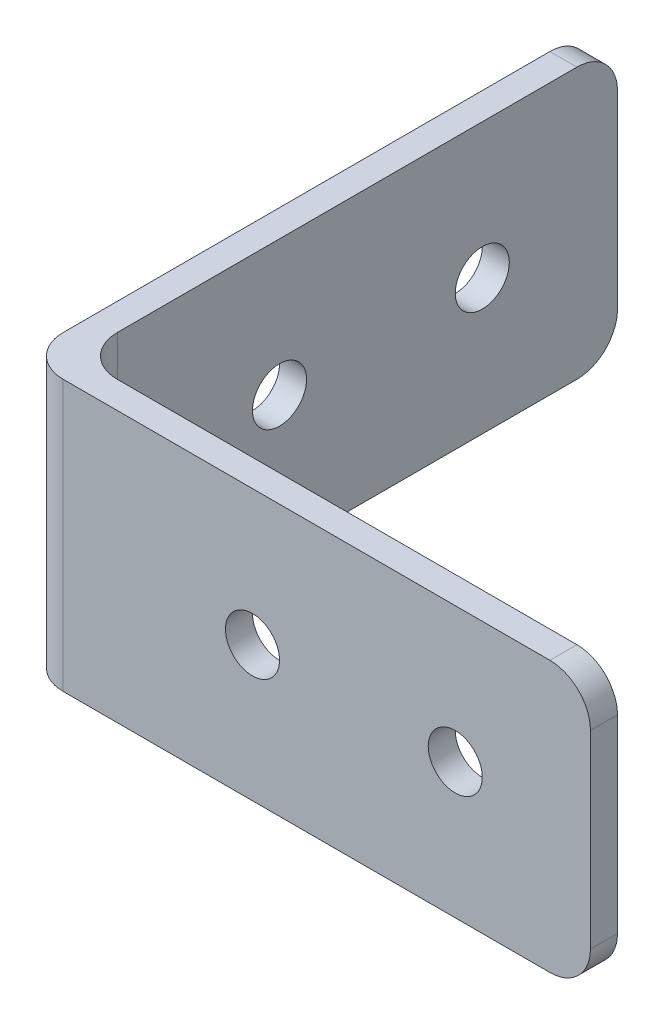
ISO-10303-21;
HEADER;
FILE_DESCRIPTION(('STEP AP214'),'2;1');
FILE_NAME('part.step','',(''),(''),'','','');
FILE_SCHEMA(('AUTOMOTIVE_DESIGN { 1 0 10303 214 1 1 1 1 }'));
ENDSEC;
DATA;
#1=APPLICATION_CONTEXT('core data for automotive mechanical design processes');
#2=APPLICATION_PROTOCOL_DEFINITION('international standard','automotive_design',2000,#1);
#3=PRODUCT_CONTEXT('',#1,'mechanical');
#4=PRODUCT('Part','Part','',(#3));
#5=PRODUCT_RELATED_PRODUCT_CATEGORY('part','',(#4));
#6=PRODUCT_DEFINITION_FORMATION('','',#4);
#7=PRODUCT_DEFINITION_CONTEXT('part definition',#1,'design');
#8=PRODUCT_DEFINITION('design','',#6,#7);
#9=PRODUCT_DEFINITION_SHAPE('','',#8);
#10=(LENGTH_UNIT() NAMED_UNIT(*) SI_UNIT(.MILLI.,.METRE.));
#11=(NAMED_UNIT(*) PLANE_ANGLE_UNIT() SI_UNIT($,.RADIAN.));
#12=(NAMED_UNIT(*) SI_UNIT($,.STERADIAN.) SOLID_ANGLE_UNIT());
#13=UNCERTAINTY_MEASURE_WITH_UNIT(LENGTH_MEASURE(1.E-05),#10,'distance_accuracy_value','');
#14=(GEOMETRIC_REPRESENTATION_CONTEXT(3) GLOBAL_UNCERTAINTY_ASSIGNED_CONTEXT((#13)) GLOBAL_UNIT_ASSIGNED_CONTEXT((#10,
#11,#12)) REPRESENTATION_CONTEXT('',''));
#15=CARTESIAN_POINT('',(0.,0.,0.));
#16=DIRECTION('',(0.,0.,1.));
#17=DIRECTION('',(1.,0.,0.));
#18=AXIS2_PLACEMENT_3D('',#15,#16,#17);
#19=CARTESIAN_POINT('',(-15.6448598130841,20.,-18.3551401869159));
#20=DIRECTION('',(0.,0.,1.));
#21=DIRECTION('',(1.,0.,0.));
#22=AXIS2_PLACEMENT_3D('',#19,#20,#21);
#23=PLANE('',#22);
#24=DIRECTION('',(0.,-1.,0.));
#25=VECTOR('',#24,1.);
#26=CARTESIAN_POINT('',(-13.6448598130841,20.,-18.3551401869159));
#27=LINE('',#26,#25);
#28=CARTESIAN_POINT('',(-13.6448598130841,17.,-18.3551401869159));
#29=VERTEX_POINT('',#28);
#30=CARTESIAN_POINT('',(-13.6448598130841,3.,-18.3551401869159));
#31=VERTEX_POINT('',#30);
#32=EDGE_CURVE('E161',#29,#31,#27,.T.);
#33=ORIENTED_EDGE('',*,*,#32,.T.);
#34=DIRECTION('',(-1.,0.,0.));
#35=VECTOR('',#34,1.);
#36=CARTESIAN_POINT('',(-15.6448598130841,3.,-18.3551401869159));
#37=LINE('',#36,#35);
#38=CARTESIAN_POINT('',(-15.6448598130841,3.,-18.3551401869159));
#39=VERTEX_POINT('',#38);
#40=EDGE_CURVE('E207',#31,#39,#37,.T.);
#41=ORIENTED_EDGE('',*,*,#40,.T.);
#42=DIRECTION('',(0.,-1.,0.));
#43=VECTOR('',#42,1.);
#44=CARTESIAN_POINT('',(-15.6448598130841,20.,-18.3551401869159));
#45=LINE('',#44,#43);
#46=CARTESIAN_POINT('',(-15.6448598130841,17.,-18.3551401869159));
#47=VERTEX_POINT('',#46);
#48=EDGE_CURVE('E177',#47,#39,#45,.T.);
#49=ORIENTED_EDGE('',*,*,#48,.F.);
#50=DIRECTION('',(-1.,0.,0.));
#51=VECTOR('',#50,1.);
#52=CARTESIAN_POINT('',(-15.6448598130841,17.,-18.3551401869159));
#53=LINE('',#52,#51);
#54=EDGE_CURVE('E54',#47,#29,#53,.F.);
#55=ORIENTED_EDGE('',*,*,#54,.T.);
#56=EDGE_LOOP('',(#33,#41,#49,#55));
#57=FACE_BOUND('',#56,.T.);
#58=ADVANCED_FACE('F32',(#57),#23,.F.);
#59=CARTESIAN_POINT('',(-15.6448598130841,20.,23.6448598130841));
#60=DIRECTION('',(1.,0.,0.));
#61=DIRECTION('',(0.,0.,-1.));
#62=AXIS2_PLACEMENT_3D('',#59,#60,#61);
#63=PLANE('',#62);
#64=CARTESIAN_POINT('',(-15.6448598130841,10.,6.64485981308411));
#65=DIRECTION('',(1.,0.,0.));
#66=DIRECTION('',(0.,0.,-1.));
#67=AXIS2_PLACEMENT_3D('',#64,#65,#66);
#68=CIRCLE('',#67,2.);
#69=CARTESIAN_POINT('',(-15.6448598130841,10.,4.64485981308411));
#70=VERTEX_POINT('',#69);
#71=EDGE_CURVE('E306',#70,#70,#68,.T.);
#72=ORIENTED_EDGE('',*,*,#71,.T.);
#73=EDGE_LOOP('',(#72));
#74=FACE_BOUND('',#73,.T.);
#75=CARTESIAN_POINT('',(-15.6448598130841,10.,-8.35514018691589));
#76=DIRECTION('',(1.,0.,0.));
#77=DIRECTION('',(0.,0.,-1.));
#78=AXIS2_PLACEMENT_3D('',#75,#76,#77);
#79=CIRCLE('',#78,2.);
#80=CARTESIAN_POINT('',(-15.6448598130841,10.,-10.3551401869159));
#81=VERTEX_POINT('',#80);
#82=EDGE_CURVE('E314',#81,#81,#79,.T.);
#83=ORIENTED_EDGE('',*,*,#82,.T.);
#84=EDGE_LOOP('',(#83));
#85=FACE_BOUND('',#84,.T.);
#86=ORIENTED_EDGE('',*,*,#48,.T.);
#87=CARTESIAN_POINT('',(-15.6448598130841,3.,-15.3551401869159));
#88=DIRECTION('',(1.,0.,0.));
#89=DIRECTION('',(0.,0.,-1.));
#90=AXIS2_PLACEMENT_3D('',#87,#88,#89);
#91=CIRCLE('',#90,3.);
#92=CARTESIAN_POINT('',(-15.6448598130841,0.,-15.3551401869159));
#93=VERTEX_POINT('',#92);
#94=EDGE_CURVE('E129',#39,#93,#91,.F.);
#95=ORIENTED_EDGE('',*,*,#94,.T.);
#96=DIRECTION('',(0.,0.,1.));
#97=VECTOR('',#96,1.);
#98=CARTESIAN_POINT('',(-15.6448598130841,0.,23.6448598130841));
#99=LINE('',#98,#97);
#100=CARTESIAN_POINT('',(-15.6448598130841,0.,20.6448598130841));
#101=VERTEX_POINT('',#100);
#102=EDGE_CURVE('E162',#93,#101,#99,.T.);
#103=ORIENTED_EDGE('',*,*,#102,.T.);
#104=DIRECTION('',(0.,-1.,0.));
#105=VECTOR('',#104,1.);
#106=CARTESIAN_POINT('',(-15.6448598130841,20.,20.6448598130841));
#107=LINE('',#106,#105);
#108=CARTESIAN_POINT('',(-15.6448598130841,20.,20.6448598130841));
#109=VERTEX_POINT('',#108);
#110=EDGE_CURVE('E130',#101,#109,#107,.F.);
#111=ORIENTED_EDGE('',*,*,#110,.T.);
#112=DIRECTION('',(0.,0.,1.));
#113=VECTOR('',#112,1.);
#114=CARTESIAN_POINT('',(-15.6448598130841,20.,23.6448598130841));
#115=LINE('',#114,#113);
#116=CARTESIAN_POINT('',(-15.6448598130841,20.,-15.3551401869159));
#117=VERTEX_POINT('',#116);
#118=EDGE_CURVE('E137',#117,#109,#115,.T.);
#119=ORIENTED_EDGE('',*,*,#118,.F.);
#120=CARTESIAN_POINT('',(-15.6448598130841,17.,-15.3551401869159));
#121=DIRECTION('',(1.,0.,0.));
#122=DIRECTION('',(0.,0.,-1.));
#123=AXIS2_PLACEMENT_3D('',#120,#121,#122);
#124=CIRCLE('',#123,3.);
#125=EDGE_CURVE('E121',#117,#47,#124,.F.);
#126=ORIENTED_EDGE('',*,*,#125,.T.);
#127=EDGE_LOOP('',(#86,#95,#103,#111,#119,#126));
#128=FACE_BOUND('',#127,.T.);
#129=ADVANCED_FACE('F144',(#74,#85,#128),#63,.F.);
#130=CARTESIAN_POINT('',(26.3551401869159,20.,23.6448598130841));
#131=DIRECTION('',(0.,0.,-1.));
#132=DIRECTION('',(-1.,0.,0.));
#133=AXIS2_PLACEMENT_3D('',#130,#131,#132);
#134=PLANE('',#133);
#135=CARTESIAN_POINT('',(16.3551401869159,9.99999999999999,23.6448598130841));
#136=DIRECTION('',(0.,0.,-1.));
#137=DIRECTION('',(-1.,0.,0.));
#138=AXIS2_PLACEMENT_3D('',#135,#136,#137);
#139=CIRCLE('',#138,2.);
#140=CARTESIAN_POINT('',(14.3551401869159,9.99999999999999,23.6448598130841));
#141=VERTEX_POINT('',#140);
#142=EDGE_CURVE('E320',#141,#141,#139,.T.);
#143=ORIENTED_EDGE('',*,*,#142,.T.);
#144=EDGE_LOOP('',(#143));
#145=FACE_BOUND('',#144,.T.);
#146=CARTESIAN_POINT('',(1.35514018691588,10.,23.6448598130841));
#147=DIRECTION('',(0.,0.,-1.));
#148=DIRECTION('',(-1.,0.,0.));
#149=AXIS2_PLACEMENT_3D('',#146,#147,#148);
#150=CIRCLE('',#149,2.);
#151=CARTESIAN_POINT('',(-0.644859813084124,10.,23.6448598130841));
#152=VERTEX_POINT('',#151);
#153=EDGE_CURVE('E165',#152,#152,#150,.T.);
#154=ORIENTED_EDGE('',*,*,#153,.T.);
#155=EDGE_LOOP('',(#154));
#156=FACE_BOUND('',#155,.T.);
#157=DIRECTION('',(0.,-1.,0.));
#158=VECTOR('',#157,1.);
#159=CARTESIAN_POINT('',(26.3551401869159,20.,23.6448598130841));
#160=LINE('',#159,#158);
#161=CARTESIAN_POINT('',(26.3551401869159,17.,23.6448598130841));
#162=VERTEX_POINT('',#161);
#163=CARTESIAN_POINT('',(26.3551401869159,3.,23.6448598130841));
#164=VERTEX_POINT('',#163);
#165=EDGE_CURVE('E174',#162,#164,#160,.T.);
#166=ORIENTED_EDGE('',*,*,#165,.F.);
#167=CARTESIAN_POINT('',(23.3551401869159,17.,23.6448598130841));
#168=DIRECTION('',(0.,0.,-1.));
#169=DIRECTION('',(-1.,0.,0.));
#170=AXIS2_PLACEMENT_3D('',#167,#168,#169);
#171=CIRCLE('',#170,3.);
#172=CARTESIAN_POINT('',(23.3551401869159,20.,23.6448598130841));
#173=VERTEX_POINT('',#172);
#174=EDGE_CURVE('E198',#162,#173,#171,.F.);
#175=ORIENTED_EDGE('',*,*,#174,.T.);
#176=DIRECTION('',(1.,0.,0.));
#177=VECTOR('',#176,1.);
#178=CARTESIAN_POINT('',(26.3551401869159,20.,23.6448598130841));
#179=LINE('',#178,#177);
#180=CARTESIAN_POINT('',(-12.6448598130841,20.,23.6448598130841));
#181=VERTEX_POINT('',#180);
#182=EDGE_CURVE('E147',#181,#173,#179,.T.);
#183=ORIENTED_EDGE('',*,*,#182,.F.);
#184=DIRECTION('',(0.,-1.,0.));
#185=VECTOR('',#184,1.);
#186=CARTESIAN_POINT('',(-12.6448598130841,20.,23.6448598130841));
#187=LINE('',#186,#185);
#188=CARTESIAN_POINT('',(-12.6448598130841,0.,23.6448598130841));
#189=VERTEX_POINT('',#188);
#190=EDGE_CURVE('E193',#181,#189,#187,.T.);
#191=ORIENTED_EDGE('',*,*,#190,.T.);
#192=DIRECTION('',(1.,0.,0.));
#193=VECTOR('',#192,1.);
#194=CARTESIAN_POINT('',(26.3551401869159,0.,23.6448598130841));
#195=LINE('',#194,#193);
#196=CARTESIAN_POINT('',(23.3551401869159,0.,23.6448598130841));
#197=VERTEX_POINT('',#196);
#198=EDGE_CURVE('E164',#189,#197,#195,.T.);
#199=ORIENTED_EDGE('',*,*,#198,.T.);
#200=CARTESIAN_POINT('',(23.3551401869159,3.,23.6448598130841));
#201=DIRECTION('',(0.,0.,-1.));
#202=DIRECTION('',(-1.,0.,0.));
#203=AXIS2_PLACEMENT_3D('',#200,#201,#202);
#204=CIRCLE('',#203,3.);
#205=EDGE_CURVE('E196',#197,#164,#204,.F.);
#206=ORIENTED_EDGE('',*,*,#205,.T.);
#207=EDGE_LOOP('',(#166,#175,#183,#191,#199,#206));
#208=FACE_BOUND('',#207,.T.);
#209=ADVANCED_FACE('F242',(#145,#156,#208),#134,.F.);
#210=CARTESIAN_POINT('',(26.3551401869159,20.,21.6448598130841));
#211=DIRECTION('',(-1.,0.,0.));
#212=DIRECTION('',(0.,0.,1.));
#213=AXIS2_PLACEMENT_3D('',#210,#211,#212);
#214=PLANE('',#213);
#215=DIRECTION('',(0.,-1.,0.));
#216=VECTOR('',#215,1.);
#217=CARTESIAN_POINT('',(26.3551401869159,20.,21.6448598130841));
#218=LINE('',#217,#216);
#219=CARTESIAN_POINT('',(26.3551401869159,17.,21.6448598130841));
#220=VERTEX_POINT('',#219);
#221=CARTESIAN_POINT('',(26.3551401869159,3.,21.6448598130841));
#222=VERTEX_POINT('',#221);
#223=EDGE_CURVE('E171',#220,#222,#218,.T.);
#224=ORIENTED_EDGE('',*,*,#223,.F.);
#225=DIRECTION('',(0.,0.,-1.));
#226=VECTOR('',#225,1.);
#227=CARTESIAN_POINT('',(26.3551401869159,17.,21.6448598130841));
#228=LINE('',#227,#226);
#229=EDGE_CURVE('E191',#220,#162,#228,.F.);
#230=ORIENTED_EDGE('',*,*,#229,.T.);
#231=ORIENTED_EDGE('',*,*,#165,.T.);
#232=DIRECTION('',(0.,0.,-1.));
#233=VECTOR('',#232,1.);
#234=CARTESIAN_POINT('',(26.3551401869159,3.,21.6448598130841));
#235=LINE('',#234,#233);
#236=EDGE_CURVE('E188',#164,#222,#235,.T.);
#237=ORIENTED_EDGE('',*,*,#236,.T.);
#238=EDGE_LOOP('',(#224,#230,#231,#237));
#239=FACE_BOUND('',#238,.T.);
#240=ADVANCED_FACE('F251',(#239),#214,.F.);
#241=CARTESIAN_POINT('',(-13.6448598130841,20.,21.6448598130841));
#242=DIRECTION('',(0.,0.,1.));
#243=DIRECTION('',(1.,0.,0.));
#244=AXIS2_PLACEMENT_3D('',#241,#242,#243);
#245=PLANE('',#244);
#246=CARTESIAN_POINT('',(16.3551401869159,9.99999999999999,21.6448598130841));
#247=DIRECTION('',(0.,0.,-1.));
#248=DIRECTION('',(-1.,0.,0.));
#249=AXIS2_PLACEMENT_3D('',#246,#247,#248);
#250=CIRCLE('',#249,2.);
#251=CARTESIAN_POINT('',(14.3551401869159,9.99999999999999,21.6448598130841));
#252=VERTEX_POINT('',#251);
#253=EDGE_CURVE('E317',#252,#252,#250,.T.);
#254=ORIENTED_EDGE('',*,*,#253,.F.);
#255=EDGE_LOOP('',(#254));
#256=FACE_BOUND('',#255,.T.);
#257=CARTESIAN_POINT('',(1.35514018691588,10.,21.6448598130841));
#258=DIRECTION('',(0.,0.,-1.));
#259=DIRECTION('',(-1.,0.,0.));
#260=AXIS2_PLACEMENT_3D('',#257,#258,#259);
#261=CIRCLE('',#260,2.);
#262=CARTESIAN_POINT('',(-0.644859813084124,10.,21.6448598130841));
#263=VERTEX_POINT('',#262);
#264=EDGE_CURVE('E155',#263,#263,#261,.T.);
#265=ORIENTED_EDGE('',*,*,#264,.F.);
#266=EDGE_LOOP('',(#265));
#267=FACE_BOUND('',#266,.T.);
#268=DIRECTION('',(-1.,0.,0.));
#269=VECTOR('',#268,1.);
#270=CARTESIAN_POINT('',(-13.6448598130841,20.,21.6448598130841));
#271=LINE('',#270,#269);
#272=CARTESIAN_POINT('',(23.3551401869159,20.,21.6448598130841));
#273=VERTEX_POINT('',#272);
#274=CARTESIAN_POINT('',(-10.6448598130841,20.,21.6448598130841));
#275=VERTEX_POINT('',#274);
#276=EDGE_CURVE('E150',#273,#275,#271,.T.);
#277=ORIENTED_EDGE('',*,*,#276,.F.);
#278=CARTESIAN_POINT('',(23.3551401869159,17.,21.6448598130841));
#279=DIRECTION('',(0.,0.,1.));
#280=DIRECTION('',(1.,0.,0.));
#281=AXIS2_PLACEMENT_3D('',#278,#279,#280);
#282=CIRCLE('',#281,3.);
#283=EDGE_CURVE('E186',#273,#220,#282,.F.);
#284=ORIENTED_EDGE('',*,*,#283,.T.);
#285=ORIENTED_EDGE('',*,*,#223,.T.);
#286=CARTESIAN_POINT('',(23.3551401869159,3.,21.6448598130841));
#287=DIRECTION('',(0.,0.,1.));
#288=DIRECTION('',(1.,0.,0.));
#289=AXIS2_PLACEMENT_3D('',#286,#287,#288);
#290=CIRCLE('',#289,3.);
#291=CARTESIAN_POINT('',(23.3551401869159,0.,21.6448598130841));
#292=VERTEX_POINT('',#291);
#293=EDGE_CURVE('E184',#222,#292,#290,.F.);
#294=ORIENTED_EDGE('',*,*,#293,.T.);
#295=DIRECTION('',(-1.,0.,0.));
#296=VECTOR('',#295,1.);
#297=CARTESIAN_POINT('',(-13.6448598130841,0.,21.6448598130841));
#298=LINE('',#297,#296);
#299=CARTESIAN_POINT('',(-10.6448598130841,0.,21.6448598130841));
#300=VERTEX_POINT('',#299);
#301=EDGE_CURVE('E152',#292,#300,#298,.T.);
#302=ORIENTED_EDGE('',*,*,#301,.T.);
#303=DIRECTION('',(0.,-1.,0.));
#304=VECTOR('',#303,1.);
#305=CARTESIAN_POINT('',(-10.6448598130841,20.,21.6448598130841));
#306=LINE('',#305,#304);
#307=EDGE_CURVE('E182',#300,#275,#306,.F.);
#308=ORIENTED_EDGE('',*,*,#307,.T.);
#309=EDGE_LOOP('',(#277,#284,#285,#294,#302,#308));
#310=FACE_BOUND('',#309,.T.);
#311=ADVANCED_FACE('F227',(#256,#267,#310),#245,.F.);
#312=CARTESIAN_POINT('',(-13.6448598130841,20.,-18.3551401869159));
#313=DIRECTION('',(-1.,0.,0.));
#314=DIRECTION('',(0.,0.,1.));
#315=AXIS2_PLACEMENT_3D('',#312,#313,#314);
#316=PLANE('',#315);
#317=CARTESIAN_POINT('',(-13.6448598130841,10.,6.64485981308411));
#318=DIRECTION('',(1.,0.,0.));
#319=DIRECTION('',(0.,0.,-1.));
#320=AXIS2_PLACEMENT_3D('',#317,#318,#319);
#321=CIRCLE('',#320,2.);
#322=CARTESIAN_POINT('',(-13.6448598130841,10.,4.64485981308411));
#323=VERTEX_POINT('',#322);
#324=EDGE_CURVE('E309',#323,#323,#321,.T.);
#325=ORIENTED_EDGE('',*,*,#324,.F.);
#326=EDGE_LOOP('',(#325));
#327=FACE_BOUND('',#326,.T.);
#328=CARTESIAN_POINT('',(-13.6448598130841,10.,-8.35514018691589));
#329=DIRECTION('',(1.,0.,0.));
#330=DIRECTION('',(0.,0.,-1.));
#331=AXIS2_PLACEMENT_3D('',#328,#329,#330);
#332=CIRCLE('',#331,2.);
#333=CARTESIAN_POINT('',(-13.6448598130841,10.,-10.3551401869159));
#334=VERTEX_POINT('',#333);
#335=EDGE_CURVE('E311',#334,#334,#332,.T.);
#336=ORIENTED_EDGE('',*,*,#335,.F.);
#337=EDGE_LOOP('',(#336));
#338=FACE_BOUND('',#337,.T.);
#339=DIRECTION('',(0.,0.,-1.));
#340=VECTOR('',#339,1.);
#341=CARTESIAN_POINT('',(-13.6448598130841,0.,-18.3551401869159));
#342=LINE('',#341,#340);
#343=CARTESIAN_POINT('',(-13.6448598130841,0.,18.6448598130841));
#344=VERTEX_POINT('',#343);
#345=CARTESIAN_POINT('',(-13.6448598130841,0.,-15.3551401869159));
#346=VERTEX_POINT('',#345);
#347=EDGE_CURVE('E148',#344,#346,#342,.T.);
#348=ORIENTED_EDGE('',*,*,#347,.T.);
#349=CARTESIAN_POINT('',(-13.6448598130841,3.,-15.3551401869159));
#350=DIRECTION('',(-1.,0.,0.));
#351=DIRECTION('',(0.,0.,1.));
#352=AXIS2_PLACEMENT_3D('',#349,#350,#351);
#353=CIRCLE('',#352,3.);
#354=EDGE_CURVE('E47',#346,#31,#353,.F.);
#355=ORIENTED_EDGE('',*,*,#354,.T.);
#356=ORIENTED_EDGE('',*,*,#32,.F.);
#357=CARTESIAN_POINT('',(-13.6448598130841,17.,-15.3551401869159));
#358=DIRECTION('',(-1.,0.,0.));
#359=DIRECTION('',(0.,0.,1.));
#360=AXIS2_PLACEMENT_3D('',#357,#358,#359);
#361=CIRCLE('',#360,3.);
#362=CARTESIAN_POINT('',(-13.6448598130841,20.,-15.3551401869159));
#363=VERTEX_POINT('',#362);
#364=EDGE_CURVE('E215',#29,#363,#361,.F.);
#365=ORIENTED_EDGE('',*,*,#364,.T.);
#366=DIRECTION('',(0.,0.,-1.));
#367=VECTOR('',#366,1.);
#368=CARTESIAN_POINT('',(-13.6448598130841,20.,-18.3551401869159));
#369=LINE('',#368,#367);
#370=CARTESIAN_POINT('',(-13.6448598130841,20.,18.6448598130841));
#371=VERTEX_POINT('',#370);
#372=EDGE_CURVE('E140',#371,#363,#369,.T.);
#373=ORIENTED_EDGE('',*,*,#372,.F.);
#374=DIRECTION('',(0.,-1.,0.));
#375=VECTOR('',#374,1.);
#376=CARTESIAN_POINT('',(-13.6448598130841,0.,18.6448598130841));
#377=LINE('',#376,#375);
#378=EDGE_CURVE('E212',#371,#344,#377,.T.);
#379=ORIENTED_EDGE('',*,*,#378,.T.);
#380=EDGE_LOOP('',(#348,#355,#356,#365,#373,#379));
#381=FACE_BOUND('',#380,.T.);
#382=ADVANCED_FACE('F230',(#327,#338,#381),#316,.F.);
#383=CARTESIAN_POINT('',(0.,20.,0.));
#384=DIRECTION('',(0.,-1.,0.));
#385=DIRECTION('',(0.,0.,-1.));
#386=AXIS2_PLACEMENT_3D('',#383,#384,#385);
#387=PLANE('',#386);
#388=ORIENTED_EDGE('',*,*,#182,.T.);
#389=DIRECTION('',(0.,0.,-1.));
#390=VECTOR('',#389,1.);
#391=CARTESIAN_POINT('',(23.3551401869159,20.,0.));
#392=LINE('',#391,#390);
#393=EDGE_CURVE('E141',#173,#273,#392,.T.);
#394=ORIENTED_EDGE('',*,*,#393,.T.);
#395=ORIENTED_EDGE('',*,*,#276,.T.);
#396=CARTESIAN_POINT('',(-10.6448598130841,20.,18.6448598130841));
#397=DIRECTION('',(0.,-1.,0.));
#398=DIRECTION('',(0.,0.,-1.));
#399=AXIS2_PLACEMENT_3D('',#396,#397,#398);
#400=CIRCLE('',#399,3.);
#401=EDGE_CURVE('E11',#275,#371,#400,.T.);
#402=ORIENTED_EDGE('',*,*,#401,.T.);
#403=ORIENTED_EDGE('',*,*,#372,.T.);
#404=DIRECTION('',(-1.,0.,0.));
#405=VECTOR('',#404,1.);
#406=CARTESIAN_POINT('',(0.,20.,-15.3551401869159));
#407=LINE('',#406,#405);
#408=EDGE_CURVE('E125',#363,#117,#407,.T.);
#409=ORIENTED_EDGE('',*,*,#408,.T.);
#410=ORIENTED_EDGE('',*,*,#118,.T.);
#411=CARTESIAN_POINT('',(-12.6448598130841,20.,20.6448598130841));
#412=DIRECTION('',(0.,-1.,0.));
#413=DIRECTION('',(0.,0.,-1.));
#414=AXIS2_PLACEMENT_3D('',#411,#412,#413);
#415=CIRCLE('',#414,3.);
#416=EDGE_CURVE('E142',#109,#181,#415,.F.);
#417=ORIENTED_EDGE('',*,*,#416,.T.);
#418=EDGE_LOOP('',(#388,#394,#395,#402,#403,#409,#410,#417));
#419=FACE_BOUND('',#418,.T.);
#420=ADVANCED_FACE('F136',(#419),#387,.F.);
#421=CARTESIAN_POINT('',(0.,0.,0.));
#422=DIRECTION('',(0.,-1.,0.));
#423=DIRECTION('',(0.,0.,-1.));
#424=AXIS2_PLACEMENT_3D('',#421,#422,#423);
#425=PLANE('',#424);
#426=ORIENTED_EDGE('',*,*,#301,.F.);
#427=DIRECTION('',(0.,0.,-1.));
#428=VECTOR('',#427,1.);
#429=CARTESIAN_POINT('',(23.3551401869159,0.,23.6448598130841));
#430=LINE('',#429,#428);
#431=EDGE_CURVE('E204',#292,#197,#430,.F.);
#432=ORIENTED_EDGE('',*,*,#431,.T.);
#433=ORIENTED_EDGE('',*,*,#198,.F.);
#434=CARTESIAN_POINT('',(-12.6448598130841,0.,20.6448598130841));
#435=DIRECTION('',(0.,-1.,0.));
#436=DIRECTION('',(0.,0.,-1.));
#437=AXIS2_PLACEMENT_3D('',#434,#435,#436);
#438=CIRCLE('',#437,3.);
#439=EDGE_CURVE('E200',#189,#101,#438,.T.);
#440=ORIENTED_EDGE('',*,*,#439,.T.);
#441=ORIENTED_EDGE('',*,*,#102,.F.);
#442=DIRECTION('',(-1.,0.,0.));
#443=VECTOR('',#442,1.);
#444=CARTESIAN_POINT('',(-13.6448598130841,0.,-15.3551401869159));
#445=LINE('',#444,#443);
#446=EDGE_CURVE('E202',#93,#346,#445,.F.);
#447=ORIENTED_EDGE('',*,*,#446,.T.);
#448=ORIENTED_EDGE('',*,*,#347,.F.);
#449=CARTESIAN_POINT('',(-10.6448598130841,0.,18.6448598130841));
#450=DIRECTION('',(0.,-1.,0.));
#451=DIRECTION('',(0.,0.,-1.));
#452=AXIS2_PLACEMENT_3D('',#449,#450,#451);
#453=CIRCLE('',#452,3.);
#454=EDGE_CURVE('E40',#344,#300,#453,.F.);
#455=ORIENTED_EDGE('',*,*,#454,.T.);
#456=EDGE_LOOP('',(#426,#432,#433,#440,#441,#447,#448,#455));
#457=FACE_BOUND('',#456,.T.);
#458=ADVANCED_FACE('F220',(#457),#425,.T.);
#459=CARTESIAN_POINT('',(23.3551401869159,17.,0.));
#460=DIRECTION('',(0.,0.,-1.));
#461=DIRECTION('',(-1.,0.,0.));
#462=AXIS2_PLACEMENT_3D('',#459,#460,#461);
#463=CYLINDRICAL_SURFACE('',#462,3.);
#464=ORIENTED_EDGE('',*,*,#174,.F.);
#465=ORIENTED_EDGE('',*,*,#229,.F.);
#466=ORIENTED_EDGE('',*,*,#283,.F.);
#467=ORIENTED_EDGE('',*,*,#393,.F.);
#468=EDGE_LOOP('',(#464,#465,#466,#467));
#469=FACE_BOUND('',#468,.T.);
#470=ADVANCED_FACE('F247',(#469),#463,.T.);
#471=CARTESIAN_POINT('',(23.3551401869159,3.,21.6448598130841));
#472=DIRECTION('',(0.,0.,1.));
#473=DIRECTION('',(1.,0.,0.));
#474=AXIS2_PLACEMENT_3D('',#471,#472,#473);
#475=CYLINDRICAL_SURFACE('',#474,3.);
#476=ORIENTED_EDGE('',*,*,#205,.F.);
#477=ORIENTED_EDGE('',*,*,#431,.F.);
#478=ORIENTED_EDGE('',*,*,#293,.F.);
#479=ORIENTED_EDGE('',*,*,#236,.F.);
#480=EDGE_LOOP('',(#476,#477,#478,#479));
#481=FACE_BOUND('',#480,.T.);
#482=ADVANCED_FACE('F254',(#481),#475,.T.);
#483=CARTESIAN_POINT('',(-15.6448598130841,3.,-15.3551401869159));
#484=DIRECTION('',(1.,0.,0.));
#485=DIRECTION('',(0.,0.,-1.));
#486=AXIS2_PLACEMENT_3D('',#483,#484,#485);
#487=CYLINDRICAL_SURFACE('',#486,3.);
#488=ORIENTED_EDGE('',*,*,#354,.F.);
#489=ORIENTED_EDGE('',*,*,#446,.F.);
#490=ORIENTED_EDGE('',*,*,#94,.F.);
#491=ORIENTED_EDGE('',*,*,#40,.F.);
#492=EDGE_LOOP('',(#488,#489,#490,#491));
#493=FACE_BOUND('',#492,.T.);
#494=ADVANCED_FACE('F233',(#493),#487,.T.);
#495=CARTESIAN_POINT('',(0.,17.,-15.3551401869159));
#496=DIRECTION('',(-1.,0.,0.));
#497=DIRECTION('',(0.,0.,1.));
#498=AXIS2_PLACEMENT_3D('',#495,#496,#497);
#499=CYLINDRICAL_SURFACE('',#498,3.);
#500=ORIENTED_EDGE('',*,*,#364,.F.);
#501=ORIENTED_EDGE('',*,*,#54,.F.);
#502=ORIENTED_EDGE('',*,*,#125,.F.);
#503=ORIENTED_EDGE('',*,*,#408,.F.);
#504=EDGE_LOOP('',(#500,#501,#502,#503));
#505=FACE_BOUND('',#504,.T.);
#506=ADVANCED_FACE('F124',(#505),#499,.T.);
#507=CARTESIAN_POINT('',(-10.6448598130841,20.,18.6448598130841));
#508=DIRECTION('',(0.,1.,0.));
#509=DIRECTION('',(0.,0.,1.));
#510=AXIS2_PLACEMENT_3D('',#507,#508,#509);
#511=CYLINDRICAL_SURFACE('',#510,3.);
#512=ORIENTED_EDGE('',*,*,#401,.F.);
#513=ORIENTED_EDGE('',*,*,#307,.F.);
#514=ORIENTED_EDGE('',*,*,#454,.F.);
#515=ORIENTED_EDGE('',*,*,#378,.F.);
#516=EDGE_LOOP('',(#512,#513,#514,#515));
#517=FACE_BOUND('',#516,.T.);
#518=ADVANCED_FACE('F229',(#517),#511,.F.);
#519=CARTESIAN_POINT('',(-12.6448598130841,20.,20.6448598130841));
#520=DIRECTION('',(0.,-1.,0.));
#521=DIRECTION('',(0.,0.,-1.));
#522=AXIS2_PLACEMENT_3D('',#519,#520,#521);
#523=CYLINDRICAL_SURFACE('',#522,3.);
#524=ORIENTED_EDGE('',*,*,#416,.F.);
#525=ORIENTED_EDGE('',*,*,#110,.F.);
#526=ORIENTED_EDGE('',*,*,#439,.F.);
#527=ORIENTED_EDGE('',*,*,#190,.F.);
#528=EDGE_LOOP('',(#524,#525,#526,#527));
#529=FACE_BOUND('',#528,.T.);
#530=ADVANCED_FACE('F34',(#529),#523,.T.);
#531=CARTESIAN_POINT('',(1.35514018691588,10.,23.6448598130841));
#532=DIRECTION('',(0.,0.,-1.));
#533=DIRECTION('',(-1.,0.,0.));
#534=AXIS2_PLACEMENT_3D('',#531,#532,#533);
#535=CYLINDRICAL_SURFACE('',#534,2.);
#536=ORIENTED_EDGE('',*,*,#153,.F.);
#537=EDGE_LOOP('',(#536));
#538=FACE_BOUND('',#537,.T.);
#539=ORIENTED_EDGE('',*,*,#264,.T.);
#540=EDGE_LOOP('',(#539));
#541=FACE_BOUND('',#540,.T.);
#542=ADVANCED_FACE('F286',(#538,#541),#535,.F.);
#543=CARTESIAN_POINT('',(16.3551401869159,9.99999999999999,23.6448598130841));
#544=DIRECTION('',(0.,0.,-1.));
#545=DIRECTION('',(-1.,0.,0.));
#546=AXIS2_PLACEMENT_3D('',#543,#544,#545);
#547=CYLINDRICAL_SURFACE('',#546,2.);
#548=ORIENTED_EDGE('',*,*,#142,.F.);
#549=EDGE_LOOP('',(#548));
#550=FACE_BOUND('',#549,.T.);
#551=ORIENTED_EDGE('',*,*,#253,.T.);
#552=EDGE_LOOP('',(#551));
#553=FACE_BOUND('',#552,.T.);
#554=ADVANCED_FACE('F289',(#550,#553),#547,.F.);
#555=CARTESIAN_POINT('',(-15.6448598130841,10.,-8.35514018691589));
#556=DIRECTION('',(1.,0.,0.));
#557=DIRECTION('',(0.,0.,-1.));
#558=AXIS2_PLACEMENT_3D('',#555,#556,#557);
#559=CYLINDRICAL_SURFACE('',#558,2.);
#560=ORIENTED_EDGE('',*,*,#82,.F.);
#561=EDGE_LOOP('',(#560));
#562=FACE_BOUND('',#561,.T.);
#563=ORIENTED_EDGE('',*,*,#335,.T.);
#564=EDGE_LOOP('',(#563));
#565=FACE_BOUND('',#564,.T.);
#566=ADVANCED_FACE('F293',(#562,#565),#559,.F.);
#567=CARTESIAN_POINT('',(-15.6448598130841,10.,6.64485981308411));
#568=DIRECTION('',(1.,0.,0.));
#569=DIRECTION('',(0.,0.,-1.));
#570=AXIS2_PLACEMENT_3D('',#567,#568,#569);
#571=CYLINDRICAL_SURFACE('',#570,2.);
#572=ORIENTED_EDGE('',*,*,#71,.F.);
#573=EDGE_LOOP('',(#572));
#574=FACE_BOUND('',#573,.T.);
#575=ORIENTED_EDGE('',*,*,#324,.T.);
#576=EDGE_LOOP('',(#575));
#577=FACE_BOUND('',#576,.T.);
#578=ADVANCED_FACE('F297',(#574,#577),#571,.F.);
#579=CLOSED_SHELL('',(#58,#129,#209,#240,#311,#382,#420,#458,#470,#482,#494,#506,#518,#530,#542,
#554,#566,#578));
#580=MANIFOLD_SOLID_BREP('B2',#579);
#581=ADVANCED_BREP_SHAPE_REPRESENTATION('',(#18,#580),#14);
#582=SHAPE_DEFINITION_REPRESENTATION(#9,#581);
ENDSEC;
END-ISO-10303-21;
